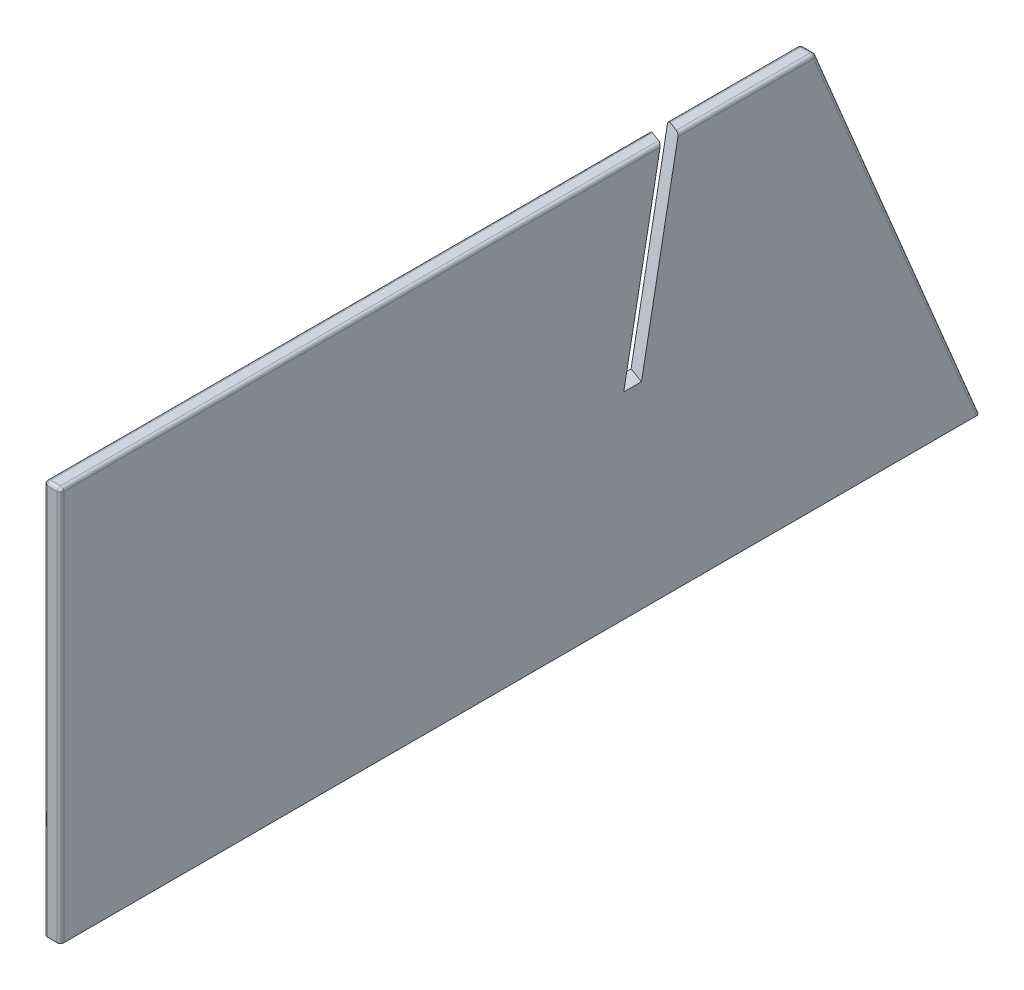
ISO-10303-21;
HEADER;
FILE_DESCRIPTION(('STEP AP214'),'2;1');
FILE_NAME('part.step','',(''),(''),'','','');
FILE_SCHEMA(('AUTOMOTIVE_DESIGN { 1 0 10303 214 1 1 1 1 }'));
ENDSEC;
DATA;
#1=APPLICATION_CONTEXT('core data for automotive mechanical design processes');
#2=APPLICATION_PROTOCOL_DEFINITION('international standard','automotive_design',2000,#1);
#3=PRODUCT_CONTEXT('',#1,'mechanical');
#4=PRODUCT('Part','Part','',(#3));
#5=PRODUCT_RELATED_PRODUCT_CATEGORY('part','',(#4));
#6=PRODUCT_DEFINITION_FORMATION('','',#4);
#7=PRODUCT_DEFINITION_CONTEXT('part definition',#1,'design');
#8=PRODUCT_DEFINITION('design','',#6,#7);
#9=PRODUCT_DEFINITION_SHAPE('','',#8);
#10=(LENGTH_UNIT() NAMED_UNIT(*) SI_UNIT(.MILLI.,.METRE.));
#11=(NAMED_UNIT(*) PLANE_ANGLE_UNIT() SI_UNIT($,.RADIAN.));
#12=(NAMED_UNIT(*) SI_UNIT($,.STERADIAN.) SOLID_ANGLE_UNIT());
#13=UNCERTAINTY_MEASURE_WITH_UNIT(LENGTH_MEASURE(1.E-05),#10,'distance_accuracy_value','');
#14=(GEOMETRIC_REPRESENTATION_CONTEXT(3) GLOBAL_UNCERTAINTY_ASSIGNED_CONTEXT((#13)) GLOBAL_UNIT_ASSIGNED_CONTEXT((#10,
#11,#12)) REPRESENTATION_CONTEXT('',''));
#15=CARTESIAN_POINT('',(0.,0.,0.));
#16=DIRECTION('',(0.,0.,1.));
#17=DIRECTION('',(1.,0.,0.));
#18=AXIS2_PLACEMENT_3D('',#15,#16,#17);
#19=CARTESIAN_POINT('',(12.7,304.8,0.));
#20=DIRECTION('',(0.,1.,0.));
#21=DIRECTION('',(0.,0.,1.));
#22=AXIS2_PLACEMENT_3D('',#19,#20,#21);
#23=PLANE('',#22);
#24=DIRECTION('',(-1.,0.,0.));
#25=VECTOR('',#24,1.);
#26=CARTESIAN_POINT('',(12.7,304.8,-2.54));
#27=LINE('',#26,#25);
#28=CARTESIAN_POINT('',(2.54,304.8,-2.54));
#29=VERTEX_POINT('',#28);
#30=CARTESIAN_POINT('',(10.16,304.8,-2.54));
#31=VERTEX_POINT('',#30);
#32=EDGE_CURVE('E92',#29,#31,#27,.F.);
#33=ORIENTED_EDGE('',*,*,#32,.T.);
#34=DIRECTION('',(0.,0.,-1.));
#35=VECTOR('',#34,1.);
#36=CARTESIAN_POINT('',(10.16,304.8,0.));
#37=LINE('',#36,#35);
#38=CARTESIAN_POINT('',(10.16,304.8,-465.178513026179));
#39=VERTEX_POINT('',#38);
#40=EDGE_CURVE('E322',#31,#39,#37,.T.);
#41=ORIENTED_EDGE('',*,*,#40,.T.);
#42=DIRECTION('',(0.939692620785908,0.,0.342020143325669));
#43=VECTOR('',#42,1.);
#44=CARTESIAN_POINT('',(-77.8812875427598,304.8,-497.222921078216));
#45=LINE('',#44,#43);
#46=CARTESIAN_POINT('',(2.53999999999999,304.8,-467.951966211288));
#47=VERTEX_POINT('',#46);
#48=EDGE_CURVE('E413',#47,#39,#45,.T.);
#49=ORIENTED_EDGE('',*,*,#48,.F.);
#50=DIRECTION('',(0.,0.,-1.));
#51=VECTOR('',#50,1.);
#52=CARTESIAN_POINT('',(2.54,304.8,0.));
#53=LINE('',#52,#51);
#54=EDGE_CURVE('E97',#47,#29,#53,.F.);
#55=ORIENTED_EDGE('',*,*,#54,.T.);
#56=EDGE_LOOP('',(#33,#41,#49,#55));
#57=FACE_BOUND('',#56,.T.);
#58=ADVANCED_FACE('F74',(#57),#23,.T.);
#59=DIRECTION('',(0.939692620785908,0.,0.342020143325669));
#60=VECTOR('',#59,1.);
#61=CARTESIAN_POINT('',(-73.4706238300197,304.8,-509.341120033777));
#62=LINE('',#61,#60);
#63=CARTESIAN_POINT('',(2.54,304.8,-481.675515471644));
#64=VERTEX_POINT('',#63);
#65=CARTESIAN_POINT('',(10.16,304.8,-478.902062286536));
#66=VERTEX_POINT('',#65);
#67=EDGE_CURVE('E212',#64,#66,#62,.T.);
#68=ORIENTED_EDGE('',*,*,#67,.T.);
#69=DIRECTION('',(0.,0.,-1.));
#70=VECTOR('',#69,1.);
#71=CARTESIAN_POINT('',(10.16,304.8,0.));
#72=LINE('',#71,#70);
#73=CARTESIAN_POINT('',(10.16,304.8,-582.506666666667));
#74=VERTEX_POINT('',#73);
#75=EDGE_CURVE('E255',#66,#74,#72,.T.);
#76=ORIENTED_EDGE('',*,*,#75,.T.);
#77=DIRECTION('',(-1.,0.,0.));
#78=VECTOR('',#77,1.);
#79=CARTESIAN_POINT('',(0.,304.8,-582.506666666667));
#80=LINE('',#79,#78);
#81=CARTESIAN_POINT('',(2.54,304.8,-582.506666666667));
#82=VERTEX_POINT('',#81);
#83=EDGE_CURVE('E251',#74,#82,#80,.T.);
#84=ORIENTED_EDGE('',*,*,#83,.T.);
#85=DIRECTION('',(0.,0.,-1.));
#86=VECTOR('',#85,1.);
#87=CARTESIAN_POINT('',(2.54,304.8,-482.599999866681));
#88=LINE('',#87,#86);
#89=EDGE_CURVE('E248',#82,#64,#88,.F.);
#90=ORIENTED_EDGE('',*,*,#89,.T.);
#91=EDGE_LOOP('',(#68,#76,#84,#90));
#92=FACE_BOUND('',#91,.T.);
#93=ADVANCED_FACE('F410',(#92),#23,.T.);
#94=CARTESIAN_POINT('',(0.,0.,0.));
#95=DIRECTION('',(1.,0.,0.));
#96=DIRECTION('',(0.,0.,-1.));
#97=AXIS2_PLACEMENT_3D('',#94,#95,#96);
#98=PLANE('',#97);
#99=DIRECTION('',(0.,-0.982846674800218,0.184424547807917));
#100=VECTOR('',#99,1.);
#101=CARTESIAN_POINT('',(0.,-77.1096006894336,-410.937239828379));
#102=LINE('',#101,#100);
#103=CARTESIAN_POINT('',(0.,302.26,-482.123386002644));
#104=VERTEX_POINT('',#103);
#105=CARTESIAN_POINT('',(0.,152.4,-454.003168024481));
#106=VERTEX_POINT('',#105);
#107=EDGE_CURVE('E188',#104,#106,#102,.T.);
#108=ORIENTED_EDGE('',*,*,#107,.F.);
#109=DIRECTION('',(0.,0.,-1.));
#110=VECTOR('',#109,1.);
#111=CARTESIAN_POINT('',(0.,302.26,-584.2));
#112=LINE('',#111,#110);
#113=CARTESIAN_POINT('',(0.,302.26,-582.506666666667));
#114=VERTEX_POINT('',#113);
#115=EDGE_CURVE('E294',#104,#114,#112,.T.);
#116=ORIENTED_EDGE('',*,*,#115,.T.);
#117=DIRECTION('',(0.,0.923076923076923,0.384615384615385));
#118=VECTOR('',#117,1.);
#119=CARTESIAN_POINT('',(0.,251.520118343195,-603.648284023669));
#120=LINE('',#119,#118);
#121=CARTESIAN_POINT('',(0.,0.,-708.448333333333));
#122=VERTEX_POINT('',#121);
#123=EDGE_CURVE('E291',#114,#122,#120,.F.);
#124=ORIENTED_EDGE('',*,*,#123,.T.);
#125=DIRECTION('',(0.,0.,-1.));
#126=VECTOR('',#125,1.);
#127=CARTESIAN_POINT('',(0.,0.,0.));
#128=LINE('',#127,#126);
#129=CARTESIAN_POINT('',(0.,0.,-2.54));
#130=VERTEX_POINT('',#129);
#131=EDGE_CURVE('E219',#130,#122,#128,.T.);
#132=ORIENTED_EDGE('',*,*,#131,.F.);
#133=DIRECTION('',(0.,1.,0.));
#134=VECTOR('',#133,1.);
#135=CARTESIAN_POINT('',(0.,304.8,-2.54));
#136=LINE('',#135,#134);
#137=CARTESIAN_POINT('',(0.,302.26,-2.54));
#138=VERTEX_POINT('',#137);
#139=EDGE_CURVE('E287',#130,#138,#136,.T.);
#140=ORIENTED_EDGE('',*,*,#139,.T.);
#141=DIRECTION('',(0.,0.,-1.));
#142=VECTOR('',#141,1.);
#143=CARTESIAN_POINT('',(0.,302.26,-468.876450606324));
#144=LINE('',#143,#142);
#145=CARTESIAN_POINT('',(0.,302.26,-468.399836742287));
#146=VERTEX_POINT('',#145);
#147=EDGE_CURVE('E284',#138,#146,#144,.T.);
#148=ORIENTED_EDGE('',*,*,#147,.T.);
#149=DIRECTION('',(0.,0.982846674800218,-0.184424547807917));
#150=VECTOR('',#149,1.);
#151=CARTESIAN_POINT('',(0.,-74.6220556918562,-397.680461604739));
#152=LINE('',#151,#150);
#153=CARTESIAN_POINT('',(0.,152.4,-440.279618764125));
#154=VERTEX_POINT('',#153);
#155=EDGE_CURVE('E201',#154,#146,#152,.T.);
#156=ORIENTED_EDGE('',*,*,#155,.F.);
#157=DIRECTION('',(0.,0.,1.));
#158=VECTOR('',#157,1.);
#159=CARTESIAN_POINT('',(0.,152.4,0.));
#160=LINE('',#159,#158);
#161=EDGE_CURVE('E207',#106,#154,#160,.T.);
#162=ORIENTED_EDGE('',*,*,#161,.F.);
#163=EDGE_LOOP('',(#108,#116,#124,#132,#140,#148,#156,#162));
#164=FACE_BOUND('',#163,.T.);
#165=ADVANCED_FACE('F216',(#164),#98,.F.);
#166=CARTESIAN_POINT('',(12.7,0.,0.));
#167=DIRECTION('',(1.,0.,0.));
#168=DIRECTION('',(0.,0.,-1.));
#169=AXIS2_PLACEMENT_3D('',#166,#167,#168);
#170=PLANE('',#169);
#171=DIRECTION('',(0.,0.923076923076923,0.384615384615385));
#172=VECTOR('',#171,1.);
#173=CARTESIAN_POINT('',(12.7,303.823076923077,-581.855384615384));
#174=LINE('',#173,#172);
#175=CARTESIAN_POINT('',(12.7,0.,-708.448333333333));
#176=VERTEX_POINT('',#175);
#177=CARTESIAN_POINT('',(12.7,302.26,-582.506666666667));
#178=VERTEX_POINT('',#177);
#179=EDGE_CURVE('E273',#176,#178,#174,.T.);
#180=ORIENTED_EDGE('',*,*,#179,.T.);
#181=DIRECTION('',(0.,0.,-1.));
#182=VECTOR('',#181,1.);
#183=CARTESIAN_POINT('',(12.7,302.26,0.));
#184=LINE('',#183,#182);
#185=CARTESIAN_POINT('',(12.7,302.26,-477.500964027463));
#186=VERTEX_POINT('',#185);
#187=EDGE_CURVE('E276',#178,#186,#184,.F.);
#188=ORIENTED_EDGE('',*,*,#187,.T.);
#189=DIRECTION('',(0.,-0.982846674800218,0.184424547807917));
#190=VECTOR('',#189,1.);
#191=CARTESIAN_POINT('',(12.7,-76.2717356121924,-406.472037582334));
#192=LINE('',#191,#190);
#193=CARTESIAN_POINT('',(12.7,152.4,-449.380746049301));
#194=VERTEX_POINT('',#193);
#195=EDGE_CURVE('E239',#186,#194,#192,.T.);
#196=ORIENTED_EDGE('',*,*,#195,.T.);
#197=DIRECTION('',(0.,0.,1.));
#198=VECTOR('',#197,1.);
#199=CARTESIAN_POINT('',(12.7,152.4,0.));
#200=LINE('',#199,#198);
#201=CARTESIAN_POINT('',(12.7,152.4,-435.657196788944));
#202=VERTEX_POINT('',#201);
#203=EDGE_CURVE('E210',#194,#202,#200,.T.);
#204=ORIENTED_EDGE('',*,*,#203,.T.);
#205=DIRECTION('',(0.,0.982846674800218,-0.184424547807917));
#206=VECTOR('',#205,1.);
#207=CARTESIAN_POINT('',(12.7,-73.7841906146151,-393.215259358694));
#208=LINE('',#207,#206);
#209=CARTESIAN_POINT('',(12.7,302.26,-463.777414767107));
#210=VERTEX_POINT('',#209);
#211=EDGE_CURVE('E244',#202,#210,#208,.T.);
#212=ORIENTED_EDGE('',*,*,#211,.T.);
#213=DIRECTION('',(0.,0.,-1.));
#214=VECTOR('',#213,1.);
#215=CARTESIAN_POINT('',(12.7,302.26,0.));
#216=LINE('',#215,#214);
#217=CARTESIAN_POINT('',(12.7,302.26,-2.54));
#218=VERTEX_POINT('',#217);
#219=EDGE_CURVE('E267',#210,#218,#216,.F.);
#220=ORIENTED_EDGE('',*,*,#219,.T.);
#221=DIRECTION('',(0.,1.,0.));
#222=VECTOR('',#221,1.);
#223=CARTESIAN_POINT('',(12.7,0.,-2.54));
#224=LINE('',#223,#222);
#225=CARTESIAN_POINT('',(12.7,0.,-2.54));
#226=VERTEX_POINT('',#225);
#227=EDGE_CURVE('E270',#218,#226,#224,.F.);
#228=ORIENTED_EDGE('',*,*,#227,.T.);
#229=DIRECTION('',(0.,0.,-1.));
#230=VECTOR('',#229,1.);
#231=CARTESIAN_POINT('',(12.7,0.,0.));
#232=LINE('',#231,#230);
#233=EDGE_CURVE('E224',#226,#176,#232,.T.);
#234=ORIENTED_EDGE('',*,*,#233,.T.);
#235=EDGE_LOOP('',(#180,#188,#196,#204,#212,#220,#228,#234));
#236=FACE_BOUND('',#235,.T.);
#237=ADVANCED_FACE('F391',(#236),#170,.T.);
#238=CARTESIAN_POINT('',(12.7,0.,0.));
#239=DIRECTION('',(0.,0.,1.));
#240=DIRECTION('',(1.,0.,0.));
#241=AXIS2_PLACEMENT_3D('',#238,#239,#240);
#242=PLANE('',#241);
#243=DIRECTION('',(-1.,0.,0.));
#244=VECTOR('',#243,1.);
#245=CARTESIAN_POINT('',(12.7,302.26,0.));
#246=LINE('',#245,#244);
#247=CARTESIAN_POINT('',(10.16,302.26,0.));
#248=VERTEX_POINT('',#247);
#249=CARTESIAN_POINT('',(2.54,302.26,0.));
#250=VERTEX_POINT('',#249);
#251=EDGE_CURVE('E309',#248,#250,#246,.T.);
#252=ORIENTED_EDGE('',*,*,#251,.T.);
#253=DIRECTION('',(0.,1.,0.));
#254=VECTOR('',#253,1.);
#255=CARTESIAN_POINT('',(2.54,0.,0.));
#256=LINE('',#255,#254);
#257=CARTESIAN_POINT('',(2.54,0.,0.));
#258=VERTEX_POINT('',#257);
#259=EDGE_CURVE('E315',#250,#258,#256,.F.);
#260=ORIENTED_EDGE('',*,*,#259,.T.);
#261=DIRECTION('',(-1.,0.,0.));
#262=VECTOR('',#261,1.);
#263=CARTESIAN_POINT('',(12.7,0.,0.));
#264=LINE('',#263,#262);
#265=CARTESIAN_POINT('',(10.16,0.,0.));
#266=VERTEX_POINT('',#265);
#267=EDGE_CURVE('E235',#266,#258,#264,.T.);
#268=ORIENTED_EDGE('',*,*,#267,.F.);
#269=DIRECTION('',(0.,1.,0.));
#270=VECTOR('',#269,1.);
#271=CARTESIAN_POINT('',(10.16,0.,0.));
#272=LINE('',#271,#270);
#273=EDGE_CURVE('E312',#266,#248,#272,.T.);
#274=ORIENTED_EDGE('',*,*,#273,.T.);
#275=EDGE_LOOP('',(#252,#260,#268,#274));
#276=FACE_BOUND('',#275,.T.);
#277=ADVANCED_FACE('F382',(#276),#242,.T.);
#278=CARTESIAN_POINT('',(12.7,0.,0.));
#279=DIRECTION('',(0.,1.,0.));
#280=DIRECTION('',(0.,0.,1.));
#281=AXIS2_PLACEMENT_3D('',#278,#279,#280);
#282=PLANE('',#281);
#283=DIRECTION('',(-1.,0.,0.));
#284=VECTOR('',#283,1.);
#285=CARTESIAN_POINT('',(12.7,0.,-711.2));
#286=LINE('',#285,#284);
#287=CARTESIAN_POINT('',(10.16,0.,-711.2));
#288=VERTEX_POINT('',#287);
#289=CARTESIAN_POINT('',(2.54,0.,-711.2));
#290=VERTEX_POINT('',#289);
#291=EDGE_CURVE('E230',#288,#290,#286,.T.);
#292=ORIENTED_EDGE('',*,*,#291,.F.);
#293=CARTESIAN_POINT('',(10.16,0.,-708.448333333333));
#294=DIRECTION('',(0.,1.,0.));
#295=DIRECTION('',(0.,0.,-1.));
#296=AXIS2_PLACEMENT_3D('',#293,#294,#295);
#297=ELLIPSE('',#296,2.75166666666667,2.54);
#298=EDGE_CURVE('E306',#288,#176,#297,.F.);
#299=ORIENTED_EDGE('',*,*,#298,.T.);
#300=ORIENTED_EDGE('',*,*,#233,.F.);
#301=CARTESIAN_POINT('',(10.16,0.,-2.54));
#302=DIRECTION('',(0.,1.,0.));
#303=DIRECTION('',(0.,0.,1.));
#304=AXIS2_PLACEMENT_3D('',#301,#302,#303);
#305=CIRCLE('',#304,2.54);
#306=EDGE_CURVE('E297',#226,#266,#305,.F.);
#307=ORIENTED_EDGE('',*,*,#306,.T.);
#308=ORIENTED_EDGE('',*,*,#267,.T.);
#309=CARTESIAN_POINT('',(2.54,0.,-2.54));
#310=DIRECTION('',(0.,1.,0.));
#311=DIRECTION('',(0.,0.,1.));
#312=AXIS2_PLACEMENT_3D('',#309,#310,#311);
#313=CIRCLE('',#312,2.54);
#314=EDGE_CURVE('E300',#258,#130,#313,.F.);
#315=ORIENTED_EDGE('',*,*,#314,.T.);
#316=ORIENTED_EDGE('',*,*,#131,.T.);
#317=CARTESIAN_POINT('',(2.54,0.,-708.448333333333));
#318=DIRECTION('',(0.,1.,0.));
#319=DIRECTION('',(0.,0.,1.));
#320=AXIS2_PLACEMENT_3D('',#317,#318,#319);
#321=ELLIPSE('',#320,2.75166666666667,2.54);
#322=EDGE_CURVE('E303',#122,#290,#321,.F.);
#323=ORIENTED_EDGE('',*,*,#322,.T.);
#324=EDGE_LOOP('',(#292,#299,#300,#307,#308,#315,#316,#323));
#325=FACE_BOUND('',#324,.T.);
#326=ADVANCED_FACE('F395',(#325),#282,.F.);
#327=CARTESIAN_POINT('',(12.7,252.497041420118,-605.992899408284));
#328=DIRECTION('',(0.,-0.384615384615385,0.923076923076923));
#329=DIRECTION('',(0.,-0.923076923076923,-0.384615384615385));
#330=AXIS2_PLACEMENT_3D('',#327,#328,#329);
#331=PLANE('',#330);
#332=DIRECTION('',(-1.,0.,0.));
#333=VECTOR('',#332,1.);
#334=CARTESIAN_POINT('',(12.7,303.236923076923,-584.851282051282));
#335=LINE('',#334,#333);
#336=CARTESIAN_POINT('',(2.54,303.236923076923,-584.851282051282));
#337=VERTEX_POINT('',#336);
#338=CARTESIAN_POINT('',(10.16,303.236923076923,-584.851282051282));
#339=VERTEX_POINT('',#338);
#340=EDGE_CURVE('E261',#337,#339,#335,.F.);
#341=ORIENTED_EDGE('',*,*,#340,.T.);
#342=DIRECTION('',(0.,0.923076923076923,0.384615384615385));
#343=VECTOR('',#342,1.);
#344=CARTESIAN_POINT('',(10.16,0.,-711.2));
#345=LINE('',#344,#343);
#346=EDGE_CURVE('E264',#339,#288,#345,.F.);
#347=ORIENTED_EDGE('',*,*,#346,.T.);
#348=ORIENTED_EDGE('',*,*,#291,.T.);
#349=DIRECTION('',(0.,0.923076923076923,0.384615384615385));
#350=VECTOR('',#349,1.);
#351=CARTESIAN_POINT('',(2.54,252.497041420118,-605.992899408284));
#352=LINE('',#351,#350);
#353=EDGE_CURVE('E258',#290,#337,#352,.T.);
#354=ORIENTED_EDGE('',*,*,#353,.T.);
#355=EDGE_LOOP('',(#341,#347,#348,#354));
#356=FACE_BOUND('',#355,.T.);
#357=ADVANCED_FACE('F452',(#356),#331,.F.);
#358=CARTESIAN_POINT('',(-82.6614684222473,152.4,-484.089482050915));
#359=DIRECTION('',(0.,1.,0.));
#360=DIRECTION('',(0.,0.,1.));
#361=AXIS2_PLACEMENT_3D('',#358,#359,#360);
#362=PLANE('',#361);
#363=ORIENTED_EDGE('',*,*,#161,.T.);
#364=DIRECTION('',(0.939692620785908,0.,0.342020143325669));
#365=VECTOR('',#364,1.);
#366=CARTESIAN_POINT('',(-87.0721321349874,152.4,-471.971283095354));
#367=LINE('',#366,#365);
#368=EDGE_CURVE('E202',#154,#202,#367,.T.);
#369=ORIENTED_EDGE('',*,*,#368,.T.);
#370=ORIENTED_EDGE('',*,*,#203,.F.);
#371=DIRECTION('',(0.939692620785908,0.,0.342020143325669));
#372=VECTOR('',#371,1.);
#373=CARTESIAN_POINT('',(-82.6614684222473,152.4,-484.089482050915));
#374=LINE('',#373,#372);
#375=EDGE_CURVE('E192',#106,#194,#374,.T.);
#376=ORIENTED_EDGE('',*,*,#375,.F.);
#377=EDGE_LOOP('',(#363,#369,#370,#376));
#378=FACE_BOUND('',#377,.T.);
#379=ADVANCED_FACE('F205',(#378),#362,.T.);
#380=CARTESIAN_POINT('',(-87.0721321349874,152.4,-471.971283095354));
#381=DIRECTION('',(0.336824088833466,-0.173648177666931,-0.925416578398323));
#382=DIRECTION('',(-0.939692620785908,0.,-0.342020143325669));
#383=AXIS2_PLACEMENT_3D('',#380,#381,#382);
#384=PLANE('',#383);
#385=ORIENTED_EDGE('',*,*,#48,.T.);
#386=CARTESIAN_POINT('',(10.16,302.26,-464.701899162143));
#387=DIRECTION('',(0.336824088833466,-0.173648177666931,-0.925416578398323));
#388=DIRECTION('',(-0.822539786250799,0.424056769323342,-0.378951390583991));
#389=AXIS2_PLACEMENT_3D('',#386,#387,#388);
#390=ELLIPSE('',#389,2.74470985207131,2.54);
#391=EDGE_CURVE('E12',#39,#210,#390,.T.);
#392=ORIENTED_EDGE('',*,*,#391,.T.);
#393=ORIENTED_EDGE('',*,*,#211,.F.);
#394=ORIENTED_EDGE('',*,*,#368,.F.);
#395=ORIENTED_EDGE('',*,*,#155,.T.);
#396=CARTESIAN_POINT('',(2.54,302.26,-467.475352347251));
#397=DIRECTION('',(0.336824088833466,-0.173648177666931,-0.925416578398323));
#398=DIRECTION('',(0.822539786250799,-0.424056769323342,0.378951390583991));
#399=AXIS2_PLACEMENT_3D('',#396,#397,#398);
#400=ELLIPSE('',#399,2.74470985207131,2.54);
#401=EDGE_CURVE('E84',#146,#47,#400,.T.);
#402=ORIENTED_EDGE('',*,*,#401,.T.);
#403=EDGE_LOOP('',(#385,#392,#393,#394,#395,#402));
#404=FACE_BOUND('',#403,.T.);
#405=ADVANCED_FACE('F422',(#404),#384,.T.);
#406=CARTESIAN_POINT('',(-73.4706238300197,304.8,-509.341120033777));
#407=DIRECTION('',(-0.336824088833466,0.173648177666931,0.925416578398323));
#408=DIRECTION('',(0.939692620785908,0.,0.342020143325669));
#409=AXIS2_PLACEMENT_3D('',#406,#407,#408);
#410=PLANE('',#409);
#411=ORIENTED_EDGE('',*,*,#195,.F.);
#412=CARTESIAN_POINT('',(10.16,302.26,-478.425448422499));
#413=DIRECTION('',(-0.336824088833466,0.173648177666931,0.925416578398323));
#414=DIRECTION('',(-0.822539786250798,0.424056769323343,-0.378951390583991));
#415=AXIS2_PLACEMENT_3D('',#412,#413,#414);
#416=ELLIPSE('',#415,2.74470985207131,2.54);
#417=EDGE_CURVE('E281',#186,#66,#416,.T.);
#418=ORIENTED_EDGE('',*,*,#417,.T.);
#419=ORIENTED_EDGE('',*,*,#67,.F.);
#420=CARTESIAN_POINT('',(2.54,302.26,-481.198901607608));
#421=DIRECTION('',(-0.336824088833466,0.173648177666931,0.925416578398323));
#422=DIRECTION('',(0.822539786250798,-0.424056769323343,0.378951390583991));
#423=AXIS2_PLACEMENT_3D('',#420,#421,#422);
#424=ELLIPSE('',#423,2.74470985207131,2.54);
#425=EDGE_CURVE('E196',#64,#104,#424,.T.);
#426=ORIENTED_EDGE('',*,*,#425,.T.);
#427=ORIENTED_EDGE('',*,*,#107,.T.);
#428=ORIENTED_EDGE('',*,*,#375,.T.);
#429=EDGE_LOOP('',(#411,#418,#419,#426,#427,#428));
#430=FACE_BOUND('',#429,.T.);
#431=ADVANCED_FACE('F191',(#430),#410,.T.);
#432=CARTESIAN_POINT('',(10.16,251.520118343195,-603.648284023669));
#433=DIRECTION('',(0.,-0.923076923076923,-0.384615384615385));
#434=DIRECTION('',(0.,0.384615384615385,-0.923076923076923));
#435=AXIS2_PLACEMENT_3D('',#432,#433,#434);
#436=CYLINDRICAL_SURFACE('',#435,2.54);
#437=ORIENTED_EDGE('',*,*,#298,.F.);
#438=ORIENTED_EDGE('',*,*,#346,.F.);
#439=CARTESIAN_POINT('',(10.16,302.26,-582.506666666667));
#440=DIRECTION('',(0.,0.923076923076935,0.384615384615357));
#441=DIRECTION('',(0.,-0.384615384615357,0.923076923076935));
#442=AXIS2_PLACEMENT_3D('',#439,#440,#441);
#443=CIRCLE('',#442,2.54);
#444=EDGE_CURVE('E213',#178,#339,#443,.T.);
#445=ORIENTED_EDGE('',*,*,#444,.F.);
#446=ORIENTED_EDGE('',*,*,#179,.F.);
#447=EDGE_LOOP('',(#437,#438,#445,#446));
#448=FACE_BOUND('',#447,.T.);
#449=ADVANCED_FACE('F399',(#448),#436,.T.);
#450=CARTESIAN_POINT('',(10.16,302.26,0.));
#451=DIRECTION('',(0.,0.,-1.));
#452=DIRECTION('',(-1.,0.,0.));
#453=AXIS2_PLACEMENT_3D('',#450,#451,#452);
#454=CYLINDRICAL_SURFACE('',#453,2.54);
#455=ORIENTED_EDGE('',*,*,#417,.F.);
#456=ORIENTED_EDGE('',*,*,#187,.F.);
#457=CARTESIAN_POINT('',(10.16,302.26,-582.506666666667));
#458=DIRECTION('',(0.,0.,-1.));
#459=DIRECTION('',(-1.,0.,0.));
#460=AXIS2_PLACEMENT_3D('',#457,#458,#459);
#461=CIRCLE('',#460,2.54);
#462=EDGE_CURVE('E342',#74,#178,#461,.T.);
#463=ORIENTED_EDGE('',*,*,#462,.F.);
#464=ORIENTED_EDGE('',*,*,#75,.F.);
#465=EDGE_LOOP('',(#455,#456,#463,#464));
#466=FACE_BOUND('',#465,.T.);
#467=ADVANCED_FACE('F405',(#466),#454,.T.);
#468=CARTESIAN_POINT('',(2.54,302.26,0.));
#469=DIRECTION('',(0.,0.,1.));
#470=DIRECTION('',(1.,0.,0.));
#471=AXIS2_PLACEMENT_3D('',#468,#469,#470);
#472=CYLINDRICAL_SURFACE('',#471,2.54);
#473=ORIENTED_EDGE('',*,*,#425,.F.);
#474=ORIENTED_EDGE('',*,*,#89,.F.);
#475=CARTESIAN_POINT('',(2.54,302.26,-582.506666666667));
#476=DIRECTION('',(0.,0.,-1.));
#477=DIRECTION('',(0.,1.,0.));
#478=AXIS2_PLACEMENT_3D('',#475,#476,#477);
#479=CIRCLE('',#478,2.54);
#480=EDGE_CURVE('E338',#114,#82,#479,.T.);
#481=ORIENTED_EDGE('',*,*,#480,.F.);
#482=ORIENTED_EDGE('',*,*,#115,.F.);
#483=EDGE_LOOP('',(#473,#474,#481,#482));
#484=FACE_BOUND('',#483,.T.);
#485=ADVANCED_FACE('F444',(#484),#472,.T.);
#486=CARTESIAN_POINT('',(2.54,251.520118343195,-603.648284023669));
#487=DIRECTION('',(0.,0.923076923076923,0.384615384615385));
#488=DIRECTION('',(0.,-0.384615384615385,0.923076923076923));
#489=AXIS2_PLACEMENT_3D('',#486,#487,#488);
#490=CYLINDRICAL_SURFACE('',#489,2.54);
#491=ORIENTED_EDGE('',*,*,#322,.F.);
#492=ORIENTED_EDGE('',*,*,#123,.F.);
#493=CARTESIAN_POINT('',(2.54,302.26,-582.506666666667));
#494=DIRECTION('',(0.,0.92307692307692,0.384615384615391));
#495=DIRECTION('',(0.,-0.384615384615391,0.923076923076921));
#496=AXIS2_PLACEMENT_3D('',#493,#494,#495);
#497=CIRCLE('',#496,2.54);
#498=EDGE_CURVE('E334',#337,#114,#497,.T.);
#499=ORIENTED_EDGE('',*,*,#498,.F.);
#500=ORIENTED_EDGE('',*,*,#353,.F.);
#501=EDGE_LOOP('',(#491,#492,#499,#500));
#502=FACE_BOUND('',#501,.T.);
#503=ADVANCED_FACE('F440',(#502),#490,.T.);
#504=CARTESIAN_POINT('',(10.16,302.26,-582.506666666667));
#505=DIRECTION('',(1.,0.,0.));
#506=DIRECTION('',(0.,0.,-1.));
#507=AXIS2_PLACEMENT_3D('',#504,#505,#506);
#508=SPHERICAL_SURFACE('',#507,2.54);
#509=ORIENTED_EDGE('',*,*,#462,.T.);
#510=ORIENTED_EDGE('',*,*,#444,.T.);
#511=CARTESIAN_POINT('',(10.16,302.26,-582.506666666667));
#512=DIRECTION('',(1.,0.,0.));
#513=DIRECTION('',(0.,0.,-1.));
#514=AXIS2_PLACEMENT_3D('',#511,#512,#513);
#515=CIRCLE('',#514,2.54);
#516=EDGE_CURVE('E330',#74,#339,#515,.F.);
#517=ORIENTED_EDGE('',*,*,#516,.F.);
#518=EDGE_LOOP('',(#509,#510,#517));
#519=FACE_BOUND('',#518,.T.);
#520=ADVANCED_FACE('F505',(#519),#508,.T.);
#521=CARTESIAN_POINT('',(2.54,302.26,-582.506666666667));
#522=DIRECTION('',(-1.,0.,0.));
#523=DIRECTION('',(0.,0.,1.));
#524=AXIS2_PLACEMENT_3D('',#521,#522,#523);
#525=SPHERICAL_SURFACE('',#524,2.54);
#526=ORIENTED_EDGE('',*,*,#498,.T.);
#527=ORIENTED_EDGE('',*,*,#480,.T.);
#528=CARTESIAN_POINT('',(2.54,302.26,-582.506666666667));
#529=DIRECTION('',(-1.,0.,0.));
#530=DIRECTION('',(0.,0.,1.));
#531=AXIS2_PLACEMENT_3D('',#528,#529,#530);
#532=CIRCLE('',#531,2.54);
#533=EDGE_CURVE('E327',#337,#82,#532,.F.);
#534=ORIENTED_EDGE('',*,*,#533,.F.);
#535=EDGE_LOOP('',(#526,#527,#534));
#536=FACE_BOUND('',#535,.T.);
#537=ADVANCED_FACE('F447',(#536),#525,.T.);
#538=CARTESIAN_POINT('',(12.7,302.26,-582.506666666667));
#539=DIRECTION('',(1.,0.,0.));
#540=DIRECTION('',(0.,0.,-1.));
#541=AXIS2_PLACEMENT_3D('',#538,#539,#540);
#542=CYLINDRICAL_SURFACE('',#541,2.54);
#543=ORIENTED_EDGE('',*,*,#516,.T.);
#544=ORIENTED_EDGE('',*,*,#340,.F.);
#545=ORIENTED_EDGE('',*,*,#533,.T.);
#546=ORIENTED_EDGE('',*,*,#83,.F.);
#547=EDGE_LOOP('',(#543,#544,#545,#546));
#548=FACE_BOUND('',#547,.T.);
#549=ADVANCED_FACE('F450',(#548),#542,.T.);
#550=CARTESIAN_POINT('',(10.16,302.26,0.));
#551=DIRECTION('',(0.,0.,-1.));
#552=DIRECTION('',(-1.,0.,0.));
#553=AXIS2_PLACEMENT_3D('',#550,#551,#552);
#554=CYLINDRICAL_SURFACE('',#553,2.54);
#555=ORIENTED_EDGE('',*,*,#391,.F.);
#556=ORIENTED_EDGE('',*,*,#40,.F.);
#557=CARTESIAN_POINT('',(10.16,302.26,-2.54));
#558=DIRECTION('',(0.,0.,1.));
#559=DIRECTION('',(1.,0.,0.));
#560=AXIS2_PLACEMENT_3D('',#557,#558,#559);
#561=CIRCLE('',#560,2.54);
#562=EDGE_CURVE('E78',#218,#31,#561,.T.);
#563=ORIENTED_EDGE('',*,*,#562,.F.);
#564=ORIENTED_EDGE('',*,*,#219,.F.);
#565=EDGE_LOOP('',(#555,#556,#563,#564));
#566=FACE_BOUND('',#565,.T.);
#567=ADVANCED_FACE('F76',(#566),#554,.T.);
#568=CARTESIAN_POINT('',(10.16,0.,-2.54));
#569=DIRECTION('',(0.,1.,0.));
#570=DIRECTION('',(0.,0.,1.));
#571=AXIS2_PLACEMENT_3D('',#568,#569,#570);
#572=CYLINDRICAL_SURFACE('',#571,2.54);
#573=ORIENTED_EDGE('',*,*,#306,.F.);
#574=ORIENTED_EDGE('',*,*,#227,.F.);
#575=CARTESIAN_POINT('',(10.16,302.26,-2.54));
#576=DIRECTION('',(0.,1.,0.));
#577=DIRECTION('',(0.,0.,1.));
#578=AXIS2_PLACEMENT_3D('',#575,#576,#577);
#579=CIRCLE('',#578,2.54);
#580=EDGE_CURVE('E363',#248,#218,#579,.T.);
#581=ORIENTED_EDGE('',*,*,#580,.F.);
#582=ORIENTED_EDGE('',*,*,#273,.F.);
#583=EDGE_LOOP('',(#573,#574,#581,#582));
#584=FACE_BOUND('',#583,.T.);
#585=ADVANCED_FACE('F388',(#584),#572,.T.);
#586=CARTESIAN_POINT('',(10.16,302.26,-2.54));
#587=DIRECTION('',(1.,0.,0.));
#588=DIRECTION('',(0.,0.,-1.));
#589=AXIS2_PLACEMENT_3D('',#586,#587,#588);
#590=SPHERICAL_SURFACE('',#589,2.54);
#591=ORIENTED_EDGE('',*,*,#580,.T.);
#592=ORIENTED_EDGE('',*,*,#562,.T.);
#593=CARTESIAN_POINT('',(10.16,302.26,-2.54));
#594=DIRECTION('',(1.,0.,0.));
#595=DIRECTION('',(0.,0.,-1.));
#596=AXIS2_PLACEMENT_3D('',#593,#594,#595);
#597=CIRCLE('',#596,2.54);
#598=EDGE_CURVE('E360',#248,#31,#597,.F.);
#599=ORIENTED_EDGE('',*,*,#598,.F.);
#600=EDGE_LOOP('',(#591,#592,#599));
#601=FACE_BOUND('',#600,.T.);
#602=ADVANCED_FACE('F372',(#601),#590,.T.);
#603=CARTESIAN_POINT('',(2.54,302.26,0.));
#604=DIRECTION('',(0.,0.,1.));
#605=DIRECTION('',(1.,0.,0.));
#606=AXIS2_PLACEMENT_3D('',#603,#604,#605);
#607=CYLINDRICAL_SURFACE('',#606,2.54);
#608=ORIENTED_EDGE('',*,*,#401,.F.);
#609=ORIENTED_EDGE('',*,*,#147,.F.);
#610=CARTESIAN_POINT('',(2.54,302.26,-2.54));
#611=DIRECTION('',(0.,0.,1.));
#612=DIRECTION('',(1.,0.,0.));
#613=AXIS2_PLACEMENT_3D('',#610,#611,#612);
#614=CIRCLE('',#613,2.54);
#615=EDGE_CURVE('E356',#29,#138,#614,.T.);
#616=ORIENTED_EDGE('',*,*,#615,.F.);
#617=ORIENTED_EDGE('',*,*,#54,.F.);
#618=EDGE_LOOP('',(#608,#609,#616,#617));
#619=FACE_BOUND('',#618,.T.);
#620=ADVANCED_FACE('F425',(#619),#607,.T.);
#621=CARTESIAN_POINT('',(12.7,302.26,-2.54));
#622=DIRECTION('',(-1.,0.,0.));
#623=DIRECTION('',(0.,0.,1.));
#624=AXIS2_PLACEMENT_3D('',#621,#622,#623);
#625=CYLINDRICAL_SURFACE('',#624,2.54);
#626=ORIENTED_EDGE('',*,*,#598,.T.);
#627=ORIENTED_EDGE('',*,*,#32,.F.);
#628=CARTESIAN_POINT('',(2.54,302.26,-2.54));
#629=DIRECTION('',(-1.,0.,0.));
#630=DIRECTION('',(0.,0.,1.));
#631=AXIS2_PLACEMENT_3D('',#628,#629,#630);
#632=CIRCLE('',#631,2.54);
#633=EDGE_CURVE('E352',#250,#29,#632,.T.);
#634=ORIENTED_EDGE('',*,*,#633,.F.);
#635=ORIENTED_EDGE('',*,*,#251,.F.);
#636=EDGE_LOOP('',(#626,#627,#634,#635));
#637=FACE_BOUND('',#636,.T.);
#638=ADVANCED_FACE('F377',(#637),#625,.T.);
#639=CARTESIAN_POINT('',(2.54,302.26,-2.54));
#640=DIRECTION('',(0.,1.,0.));
#641=DIRECTION('',(0.,0.,1.));
#642=AXIS2_PLACEMENT_3D('',#639,#640,#641);
#643=SPHERICAL_SURFACE('',#642,2.54);
#644=ORIENTED_EDGE('',*,*,#633,.T.);
#645=ORIENTED_EDGE('',*,*,#615,.T.);
#646=CARTESIAN_POINT('',(2.54,302.26,-2.54));
#647=DIRECTION('',(0.,1.,0.));
#648=DIRECTION('',(0.,0.,1.));
#649=AXIS2_PLACEMENT_3D('',#646,#647,#648);
#650=CIRCLE('',#649,2.54);
#651=EDGE_CURVE('E349',#250,#138,#650,.F.);
#652=ORIENTED_EDGE('',*,*,#651,.F.);
#653=EDGE_LOOP('',(#644,#645,#652));
#654=FACE_BOUND('',#653,.T.);
#655=ADVANCED_FACE('F429',(#654),#643,.T.);
#656=CARTESIAN_POINT('',(2.54,0.,-2.54));
#657=DIRECTION('',(0.,-1.,0.));
#658=DIRECTION('',(0.,0.,-1.));
#659=AXIS2_PLACEMENT_3D('',#656,#657,#658);
#660=CYLINDRICAL_SURFACE('',#659,2.54);
#661=ORIENTED_EDGE('',*,*,#314,.F.);
#662=ORIENTED_EDGE('',*,*,#259,.F.);
#663=ORIENTED_EDGE('',*,*,#651,.T.);
#664=ORIENTED_EDGE('',*,*,#139,.F.);
#665=EDGE_LOOP('',(#661,#662,#663,#664));
#666=FACE_BOUND('',#665,.T.);
#667=ADVANCED_FACE('F433',(#666),#660,.T.);
#668=CLOSED_SHELL('',(#58,#93,#165,#237,#277,#326,#357,#379,#405,#431,#449,#467,#485,#503,#520,
#537,#549,#567,#585,#602,#620,#638,#655,#667));
#669=MANIFOLD_SOLID_BREP('B2',#668);
#670=ADVANCED_BREP_SHAPE_REPRESENTATION('',(#18,#669),#14);
#671=SHAPE_DEFINITION_REPRESENTATION(#9,#670);
ENDSEC;
END-ISO-10303-21;
